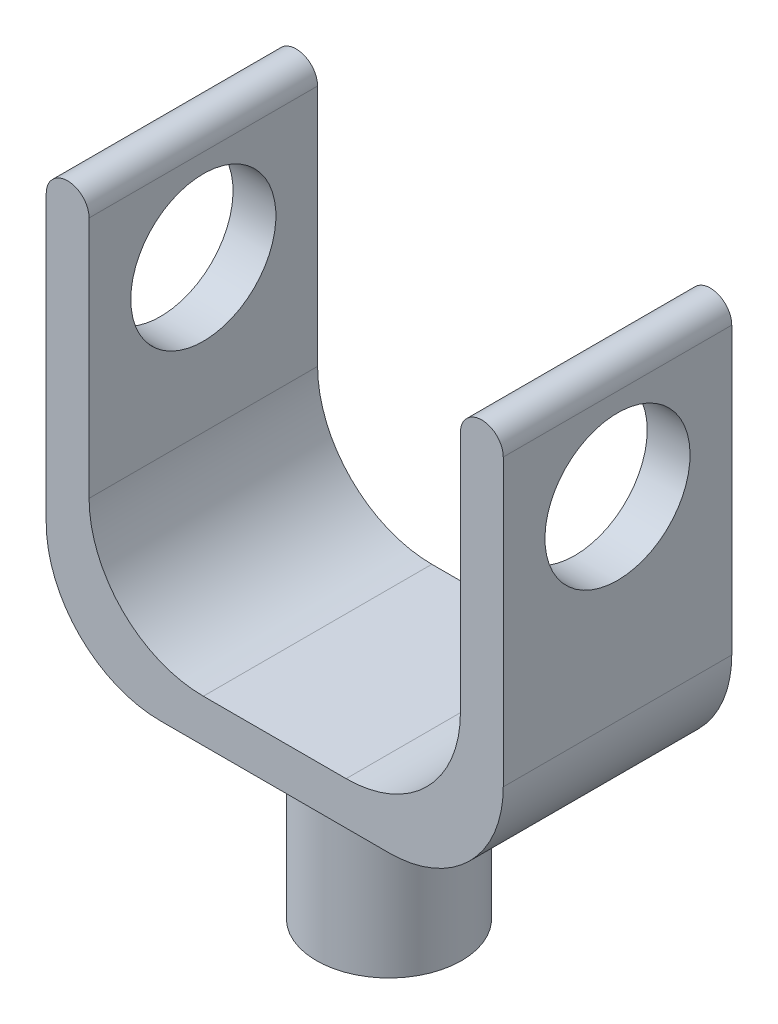
ISO-10303-21;
HEADER;
FILE_DESCRIPTION(('STEP AP214'),'2;1');
FILE_NAME('part.step','',(''),(''),'','','');
FILE_SCHEMA(('AUTOMOTIVE_DESIGN { 1 0 10303 214 1 1 1 1 }'));
ENDSEC;
DATA;
#1=APPLICATION_CONTEXT('core data for automotive mechanical design processes');
#2=APPLICATION_PROTOCOL_DEFINITION('international standard','automotive_design',2000,#1);
#3=PRODUCT_CONTEXT('',#1,'mechanical');
#4=PRODUCT('Part','Part','',(#3));
#5=PRODUCT_RELATED_PRODUCT_CATEGORY('part','',(#4));
#6=PRODUCT_DEFINITION_FORMATION('','',#4);
#7=PRODUCT_DEFINITION_CONTEXT('part definition',#1,'design');
#8=PRODUCT_DEFINITION('design','',#6,#7);
#9=PRODUCT_DEFINITION_SHAPE('','',#8);
#10=(LENGTH_UNIT() NAMED_UNIT(*) SI_UNIT(.MILLI.,.METRE.));
#11=(NAMED_UNIT(*) PLANE_ANGLE_UNIT() SI_UNIT($,.RADIAN.));
#12=(NAMED_UNIT(*) SI_UNIT($,.STERADIAN.) SOLID_ANGLE_UNIT());
#13=UNCERTAINTY_MEASURE_WITH_UNIT(LENGTH_MEASURE(1.E-05),#10,'distance_accuracy_value','');
#14=(GEOMETRIC_REPRESENTATION_CONTEXT(3) GLOBAL_UNCERTAINTY_ASSIGNED_CONTEXT((#13)) GLOBAL_UNIT_ASSIGNED_CONTEXT((#10,
#11,#12)) REPRESENTATION_CONTEXT('',''));
#15=CARTESIAN_POINT('',(0.,0.,0.));
#16=DIRECTION('',(0.,0.,1.));
#17=DIRECTION('',(1.,0.,0.));
#18=AXIS2_PLACEMENT_3D('',#15,#16,#17);
#19=CARTESIAN_POINT('',(-36.25,70.,20.));
#20=DIRECTION('',(0.,0.,-1.));
#21=DIRECTION('',(-1.,0.,0.));
#22=AXIS2_PLACEMENT_3D('',#19,#20,#21);
#23=CYLINDRICAL_SURFACE('',#22,3.75);
#24=CARTESIAN_POINT('',(-36.25,70.,-20.));
#25=DIRECTION('',(0.,0.,1.));
#26=DIRECTION('',(-1.,0.,0.));
#27=AXIS2_PLACEMENT_3D('',#24,#25,#26);
#28=CIRCLE('',#27,3.75);
#29=CARTESIAN_POINT('',(-32.5,70.,-20.));
#30=VERTEX_POINT('',#29);
#31=CARTESIAN_POINT('',(-40.,70.,-20.));
#32=VERTEX_POINT('',#31);
#33=EDGE_CURVE('E147',#30,#32,#28,.T.);
#34=ORIENTED_EDGE('',*,*,#33,.T.);
#35=DIRECTION('',(0.,0.,-1.));
#36=VECTOR('',#35,1.);
#37=CARTESIAN_POINT('',(-40.,70.,20.));
#38=LINE('',#37,#36);
#39=CARTESIAN_POINT('',(-40.,70.,20.));
#40=VERTEX_POINT('',#39);
#41=EDGE_CURVE('E130',#40,#32,#38,.T.);
#42=ORIENTED_EDGE('',*,*,#41,.F.);
#43=CARTESIAN_POINT('',(-36.25,70.,20.));
#44=DIRECTION('',(0.,0.,1.));
#45=DIRECTION('',(-1.,0.,0.));
#46=AXIS2_PLACEMENT_3D('',#43,#44,#45);
#47=CIRCLE('',#46,3.75);
#48=CARTESIAN_POINT('',(-32.5,70.,20.));
#49=VERTEX_POINT('',#48);
#50=EDGE_CURVE('E135',#49,#40,#47,.T.);
#51=ORIENTED_EDGE('',*,*,#50,.F.);
#52=DIRECTION('',(0.,0.,-1.));
#53=VECTOR('',#52,1.);
#54=CARTESIAN_POINT('',(-32.5,70.,20.));
#55=LINE('',#54,#53);
#56=EDGE_CURVE('E220',#49,#30,#55,.T.);
#57=ORIENTED_EDGE('',*,*,#56,.T.);
#58=EDGE_LOOP('',(#34,#42,#51,#57));
#59=FACE_BOUND('',#58,.T.);
#60=ADVANCED_FACE('F36',(#59),#23,.T.);
#61=CARTESIAN_POINT('',(-40.,70.,20.));
#62=DIRECTION('',(1.,0.,0.));
#63=DIRECTION('',(0.,1.,0.));
#64=AXIS2_PLACEMENT_3D('',#61,#62,#63);
#65=PLANE('',#64);
#66=CARTESIAN_POINT('',(-40.,54.,0.));
#67=DIRECTION('',(1.,0.,0.));
#68=DIRECTION('',(0.,1.,0.));
#69=AXIS2_PLACEMENT_3D('',#66,#67,#68);
#70=CIRCLE('',#69,12.7);
#71=CARTESIAN_POINT('',(-40.,66.7,0.));
#72=VERTEX_POINT('',#71);
#73=EDGE_CURVE('E329',#72,#72,#70,.T.);
#74=ORIENTED_EDGE('',*,*,#73,.T.);
#75=EDGE_LOOP('',(#74));
#76=FACE_BOUND('',#75,.T.);
#77=DIRECTION('',(0.,-1.,0.));
#78=VECTOR('',#77,1.);
#79=CARTESIAN_POINT('',(-40.,70.,-20.));
#80=LINE('',#79,#78);
#81=CARTESIAN_POINT('',(-40.,20.,-20.));
#82=VERTEX_POINT('',#81);
#83=EDGE_CURVE('E227',#32,#82,#80,.T.);
#84=ORIENTED_EDGE('',*,*,#83,.T.);
#85=DIRECTION('',(0.,0.,-1.));
#86=VECTOR('',#85,1.);
#87=CARTESIAN_POINT('',(-40.,20.,20.));
#88=LINE('',#87,#86);
#89=CARTESIAN_POINT('',(-40.,20.,20.));
#90=VERTEX_POINT('',#89);
#91=EDGE_CURVE('E52',#82,#90,#88,.F.);
#92=ORIENTED_EDGE('',*,*,#91,.T.);
#93=DIRECTION('',(0.,-1.,0.));
#94=VECTOR('',#93,1.);
#95=CARTESIAN_POINT('',(-40.,70.,20.));
#96=LINE('',#95,#94);
#97=EDGE_CURVE('E126',#40,#90,#96,.T.);
#98=ORIENTED_EDGE('',*,*,#97,.F.);
#99=ORIENTED_EDGE('',*,*,#41,.T.);
#100=EDGE_LOOP('',(#84,#92,#98,#99));
#101=FACE_BOUND('',#100,.T.);
#102=ADVANCED_FACE('F128',(#76,#101),#65,.F.);
#103=CARTESIAN_POINT('',(-40.,0.,20.));
#104=DIRECTION('',(0.,1.,0.));
#105=DIRECTION('',(-1.,0.,0.));
#106=AXIS2_PLACEMENT_3D('',#103,#104,#105);
#107=PLANE('',#106);
#108=CARTESIAN_POINT('',(0.,0.,0.));
#109=DIRECTION('',(0.,-1.,0.));
#110=DIRECTION('',(1.,0.,0.));
#111=AXIS2_PLACEMENT_3D('',#108,#109,#110);
#112=CIRCLE('',#111,12.7);
#113=CARTESIAN_POINT('',(12.7,0.,0.));
#114=VERTEX_POINT('',#113);
#115=EDGE_CURVE('E148',#114,#114,#112,.T.);
#116=ORIENTED_EDGE('',*,*,#115,.F.);
#117=EDGE_LOOP('',(#116));
#118=FACE_BOUND('',#117,.T.);
#119=DIRECTION('',(1.,0.,0.));
#120=VECTOR('',#119,1.);
#121=CARTESIAN_POINT('',(-40.,0.,-20.));
#122=LINE('',#121,#120);
#123=CARTESIAN_POINT('',(-20.,0.,-20.));
#124=VERTEX_POINT('',#123);
#125=CARTESIAN_POINT('',(20.,0.,-20.));
#126=VERTEX_POINT('',#125);
#127=EDGE_CURVE('E230',#124,#126,#122,.T.);
#128=ORIENTED_EDGE('',*,*,#127,.T.);
#129=DIRECTION('',(0.,0.,-1.));
#130=VECTOR('',#129,1.);
#131=CARTESIAN_POINT('',(20.,0.,20.));
#132=LINE('',#131,#130);
#133=CARTESIAN_POINT('',(20.,0.,20.));
#134=VERTEX_POINT('',#133);
#135=EDGE_CURVE('E60',#126,#134,#132,.F.);
#136=ORIENTED_EDGE('',*,*,#135,.T.);
#137=DIRECTION('',(1.,0.,0.));
#138=VECTOR('',#137,1.);
#139=CARTESIAN_POINT('',(-40.,0.,20.));
#140=LINE('',#139,#138);
#141=CARTESIAN_POINT('',(-20.,0.,20.));
#142=VERTEX_POINT('',#141);
#143=EDGE_CURVE('E134',#142,#134,#140,.T.);
#144=ORIENTED_EDGE('',*,*,#143,.F.);
#145=DIRECTION('',(0.,0.,-1.));
#146=VECTOR('',#145,1.);
#147=CARTESIAN_POINT('',(-20.,0.,20.));
#148=LINE('',#147,#146);
#149=EDGE_CURVE('E175',#142,#124,#148,.T.);
#150=ORIENTED_EDGE('',*,*,#149,.T.);
#151=EDGE_LOOP('',(#128,#136,#144,#150));
#152=FACE_BOUND('',#151,.T.);
#153=ADVANCED_FACE('F243',(#118,#152),#107,.F.);
#154=CARTESIAN_POINT('',(40.,0.,20.));
#155=DIRECTION('',(-1.,0.,0.));
#156=DIRECTION('',(0.,0.,1.));
#157=AXIS2_PLACEMENT_3D('',#154,#155,#156);
#158=PLANE('',#157);
#159=CARTESIAN_POINT('',(40.,54.,0.));
#160=DIRECTION('',(-1.,0.,0.));
#161=DIRECTION('',(0.,-1.,0.));
#162=AXIS2_PLACEMENT_3D('',#159,#160,#161);
#163=CIRCLE('',#162,12.7);
#164=CARTESIAN_POINT('',(40.,41.3,0.));
#165=VERTEX_POINT('',#164);
#166=EDGE_CURVE('E337',#165,#165,#163,.T.);
#167=ORIENTED_EDGE('',*,*,#166,.T.);
#168=EDGE_LOOP('',(#167));
#169=FACE_BOUND('',#168,.T.);
#170=DIRECTION('',(0.,1.,0.));
#171=VECTOR('',#170,1.);
#172=CARTESIAN_POINT('',(40.,0.,20.));
#173=LINE('',#172,#171);
#174=CARTESIAN_POINT('',(40.,20.,20.));
#175=VERTEX_POINT('',#174);
#176=CARTESIAN_POINT('',(40.,70.,20.));
#177=VERTEX_POINT('',#176);
#178=EDGE_CURVE('E244',#175,#177,#173,.T.);
#179=ORIENTED_EDGE('',*,*,#178,.F.);
#180=DIRECTION('',(0.,0.,-1.));
#181=VECTOR('',#180,1.);
#182=CARTESIAN_POINT('',(40.,20.,20.));
#183=LINE('',#182,#181);
#184=CARTESIAN_POINT('',(40.,20.,-20.));
#185=VERTEX_POINT('',#184);
#186=EDGE_CURVE('E168',#175,#185,#183,.T.);
#187=ORIENTED_EDGE('',*,*,#186,.T.);
#188=DIRECTION('',(0.,1.,0.));
#189=VECTOR('',#188,1.);
#190=CARTESIAN_POINT('',(40.,0.,-20.));
#191=LINE('',#190,#189);
#192=CARTESIAN_POINT('',(40.,70.,-20.));
#193=VERTEX_POINT('',#192);
#194=EDGE_CURVE('E232',#185,#193,#191,.T.);
#195=ORIENTED_EDGE('',*,*,#194,.T.);
#196=DIRECTION('',(0.,0.,-1.));
#197=VECTOR('',#196,1.);
#198=CARTESIAN_POINT('',(40.,70.,20.));
#199=LINE('',#198,#197);
#200=EDGE_CURVE('E149',#177,#193,#199,.T.);
#201=ORIENTED_EDGE('',*,*,#200,.F.);
#202=EDGE_LOOP('',(#179,#187,#195,#201));
#203=FACE_BOUND('',#202,.T.);
#204=ADVANCED_FACE('F253',(#169,#203),#158,.F.);
#205=CARTESIAN_POINT('',(36.25,70.,20.));
#206=DIRECTION('',(0.,0.,-1.));
#207=DIRECTION('',(-1.,0.,0.));
#208=AXIS2_PLACEMENT_3D('',#205,#206,#207);
#209=CYLINDRICAL_SURFACE('',#208,3.75);
#210=CARTESIAN_POINT('',(36.25,70.,-20.));
#211=DIRECTION('',(0.,0.,1.));
#212=DIRECTION('',(1.,0.,0.));
#213=AXIS2_PLACEMENT_3D('',#210,#211,#212);
#214=CIRCLE('',#213,3.75);
#215=CARTESIAN_POINT('',(32.5,70.,-20.));
#216=VERTEX_POINT('',#215);
#217=EDGE_CURVE('E207',#193,#216,#214,.T.);
#218=ORIENTED_EDGE('',*,*,#217,.T.);
#219=DIRECTION('',(0.,0.,-1.));
#220=VECTOR('',#219,1.);
#221=CARTESIAN_POINT('',(32.5,70.,20.));
#222=LINE('',#221,#220);
#223=CARTESIAN_POINT('',(32.5,70.,20.));
#224=VERTEX_POINT('',#223);
#225=EDGE_CURVE('E155',#224,#216,#222,.T.);
#226=ORIENTED_EDGE('',*,*,#225,.F.);
#227=CARTESIAN_POINT('',(36.25,70.,20.));
#228=DIRECTION('',(0.,0.,1.));
#229=DIRECTION('',(1.,0.,0.));
#230=AXIS2_PLACEMENT_3D('',#227,#228,#229);
#231=CIRCLE('',#230,3.75);
#232=EDGE_CURVE('E222',#177,#224,#231,.T.);
#233=ORIENTED_EDGE('',*,*,#232,.F.);
#234=ORIENTED_EDGE('',*,*,#200,.T.);
#235=EDGE_LOOP('',(#218,#226,#233,#234));
#236=FACE_BOUND('',#235,.T.);
#237=ADVANCED_FACE('F251',(#236),#209,.T.);
#238=CARTESIAN_POINT('',(32.5,7.5,20.));
#239=DIRECTION('',(1.,0.,0.));
#240=DIRECTION('',(0.,0.,-1.));
#241=AXIS2_PLACEMENT_3D('',#238,#239,#240);
#242=PLANE('',#241);
#243=CARTESIAN_POINT('',(32.5,54.,0.));
#244=DIRECTION('',(1.,0.,0.));
#245=DIRECTION('',(0.,0.,-1.));
#246=AXIS2_PLACEMENT_3D('',#243,#244,#245);
#247=CIRCLE('',#246,12.7);
#248=CARTESIAN_POINT('',(32.5,54.,-12.7));
#249=VERTEX_POINT('',#248);
#250=EDGE_CURVE('E330',#249,#249,#247,.T.);
#251=ORIENTED_EDGE('',*,*,#250,.T.);
#252=EDGE_LOOP('',(#251));
#253=FACE_BOUND('',#252,.T.);
#254=DIRECTION('',(0.,-1.,0.));
#255=VECTOR('',#254,1.);
#256=CARTESIAN_POINT('',(32.5,7.5,-20.));
#257=LINE('',#256,#255);
#258=CARTESIAN_POINT('',(32.5,27.5,-20.));
#259=VERTEX_POINT('',#258);
#260=EDGE_CURVE('E195',#216,#259,#257,.T.);
#261=ORIENTED_EDGE('',*,*,#260,.T.);
#262=DIRECTION('',(0.,0.,-1.));
#263=VECTOR('',#262,1.);
#264=CARTESIAN_POINT('',(32.5,27.5,20.));
#265=LINE('',#264,#263);
#266=CARTESIAN_POINT('',(32.5,27.5,20.));
#267=VERTEX_POINT('',#266);
#268=EDGE_CURVE('E166',#259,#267,#265,.F.);
#269=ORIENTED_EDGE('',*,*,#268,.T.);
#270=DIRECTION('',(0.,-1.,0.));
#271=VECTOR('',#270,1.);
#272=CARTESIAN_POINT('',(32.5,7.5,20.));
#273=LINE('',#272,#271);
#274=EDGE_CURVE('E215',#224,#267,#273,.T.);
#275=ORIENTED_EDGE('',*,*,#274,.F.);
#276=ORIENTED_EDGE('',*,*,#225,.T.);
#277=EDGE_LOOP('',(#261,#269,#275,#276));
#278=FACE_BOUND('',#277,.T.);
#279=ADVANCED_FACE('F203',(#253,#278),#242,.F.);
#280=CARTESIAN_POINT('',(-32.5,7.5,20.));
#281=DIRECTION('',(0.,-1.,0.));
#282=DIRECTION('',(0.,0.,-1.));
#283=AXIS2_PLACEMENT_3D('',#280,#281,#282);
#284=PLANE('',#283);
#285=DIRECTION('',(-1.,0.,0.));
#286=VECTOR('',#285,1.);
#287=CARTESIAN_POINT('',(-32.5,7.5,-20.));
#288=LINE('',#287,#286);
#289=CARTESIAN_POINT('',(12.5,7.5,-20.));
#290=VERTEX_POINT('',#289);
#291=CARTESIAN_POINT('',(-12.5,7.5,-20.));
#292=VERTEX_POINT('',#291);
#293=EDGE_CURVE('E197',#290,#292,#288,.T.);
#294=ORIENTED_EDGE('',*,*,#293,.T.);
#295=DIRECTION('',(0.,0.,-1.));
#296=VECTOR('',#295,1.);
#297=CARTESIAN_POINT('',(-12.5,7.5,20.));
#298=LINE('',#297,#296);
#299=CARTESIAN_POINT('',(-12.5,7.5,20.));
#300=VERTEX_POINT('',#299);
#301=EDGE_CURVE('E164',#292,#300,#298,.F.);
#302=ORIENTED_EDGE('',*,*,#301,.T.);
#303=DIRECTION('',(-1.,0.,0.));
#304=VECTOR('',#303,1.);
#305=CARTESIAN_POINT('',(-32.5,7.5,20.));
#306=LINE('',#305,#304);
#307=CARTESIAN_POINT('',(12.5,7.5,20.));
#308=VERTEX_POINT('',#307);
#309=EDGE_CURVE('E213',#308,#300,#306,.T.);
#310=ORIENTED_EDGE('',*,*,#309,.F.);
#311=DIRECTION('',(0.,0.,-1.));
#312=VECTOR('',#311,1.);
#313=CARTESIAN_POINT('',(12.5,7.5,-20.));
#314=LINE('',#313,#312);
#315=EDGE_CURVE('E161',#308,#290,#314,.T.);
#316=ORIENTED_EDGE('',*,*,#315,.T.);
#317=EDGE_LOOP('',(#294,#302,#310,#316));
#318=FACE_BOUND('',#317,.T.);
#319=ADVANCED_FACE('F217',(#318),#284,.F.);
#320=CARTESIAN_POINT('',(-32.5,70.,20.));
#321=DIRECTION('',(-1.,0.,0.));
#322=DIRECTION('',(0.,0.,1.));
#323=AXIS2_PLACEMENT_3D('',#320,#321,#322);
#324=PLANE('',#323);
#325=CARTESIAN_POINT('',(-32.5,54.,0.));
#326=DIRECTION('',(-1.,0.,0.));
#327=DIRECTION('',(0.,0.,1.));
#328=AXIS2_PLACEMENT_3D('',#325,#326,#327);
#329=CIRCLE('',#328,12.7);
#330=CARTESIAN_POINT('',(-32.5,54.,12.7));
#331=VERTEX_POINT('',#330);
#332=EDGE_CURVE('E40',#331,#331,#329,.T.);
#333=ORIENTED_EDGE('',*,*,#332,.T.);
#334=EDGE_LOOP('',(#333));
#335=FACE_BOUND('',#334,.T.);
#336=DIRECTION('',(0.,1.,0.));
#337=VECTOR('',#336,1.);
#338=CARTESIAN_POINT('',(-32.5,70.,20.));
#339=LINE('',#338,#337);
#340=CARTESIAN_POINT('',(-32.5,27.5,20.));
#341=VERTEX_POINT('',#340);
#342=EDGE_CURVE('E140',#341,#49,#339,.T.);
#343=ORIENTED_EDGE('',*,*,#342,.F.);
#344=DIRECTION('',(0.,0.,-1.));
#345=VECTOR('',#344,1.);
#346=CARTESIAN_POINT('',(-32.5,27.5,-20.));
#347=LINE('',#346,#345);
#348=CARTESIAN_POINT('',(-32.5,27.5,-20.));
#349=VERTEX_POINT('',#348);
#350=EDGE_CURVE('E152',#341,#349,#347,.T.);
#351=ORIENTED_EDGE('',*,*,#350,.T.);
#352=DIRECTION('',(0.,1.,0.));
#353=VECTOR('',#352,1.);
#354=CARTESIAN_POINT('',(-32.5,70.,-20.));
#355=LINE('',#354,#353);
#356=EDGE_CURVE('E144',#349,#30,#355,.T.);
#357=ORIENTED_EDGE('',*,*,#356,.T.);
#358=ORIENTED_EDGE('',*,*,#56,.F.);
#359=EDGE_LOOP('',(#343,#351,#357,#358));
#360=FACE_BOUND('',#359,.T.);
#361=ADVANCED_FACE('F284',(#335,#360),#324,.F.);
#362=CARTESIAN_POINT('',(-36.25,70.,20.));
#363=DIRECTION('',(0.,0.,-1.));
#364=DIRECTION('',(-1.,0.,0.));
#365=AXIS2_PLACEMENT_3D('',#362,#363,#364);
#366=PLANE('',#365);
#367=ORIENTED_EDGE('',*,*,#143,.T.);
#368=CARTESIAN_POINT('',(20.,20.,20.));
#369=DIRECTION('',(0.,0.,-1.));
#370=DIRECTION('',(-1.,0.,0.));
#371=AXIS2_PLACEMENT_3D('',#368,#369,#370);
#372=CIRCLE('',#371,20.);
#373=EDGE_CURVE('E181',#134,#175,#372,.F.);
#374=ORIENTED_EDGE('',*,*,#373,.T.);
#375=ORIENTED_EDGE('',*,*,#178,.T.);
#376=ORIENTED_EDGE('',*,*,#232,.T.);
#377=ORIENTED_EDGE('',*,*,#274,.T.);
#378=CARTESIAN_POINT('',(12.5,27.5,20.));
#379=DIRECTION('',(0.,0.,-1.));
#380=DIRECTION('',(-1.,0.,0.));
#381=AXIS2_PLACEMENT_3D('',#378,#379,#380);
#382=CIRCLE('',#381,20.);
#383=EDGE_CURVE('E11',#267,#308,#382,.T.);
#384=ORIENTED_EDGE('',*,*,#383,.T.);
#385=ORIENTED_EDGE('',*,*,#309,.T.);
#386=CARTESIAN_POINT('',(-12.5,27.5,20.));
#387=DIRECTION('',(0.,0.,-1.));
#388=DIRECTION('',(-1.,0.,0.));
#389=AXIS2_PLACEMENT_3D('',#386,#387,#388);
#390=CIRCLE('',#389,20.);
#391=EDGE_CURVE('E186',#300,#341,#390,.T.);
#392=ORIENTED_EDGE('',*,*,#391,.T.);
#393=ORIENTED_EDGE('',*,*,#342,.T.);
#394=ORIENTED_EDGE('',*,*,#50,.T.);
#395=ORIENTED_EDGE('',*,*,#97,.T.);
#396=CARTESIAN_POINT('',(-20.,20.,20.));
#397=DIRECTION('',(0.,0.,-1.));
#398=DIRECTION('',(-1.,0.,0.));
#399=AXIS2_PLACEMENT_3D('',#396,#397,#398);
#400=CIRCLE('',#399,20.);
#401=EDGE_CURVE('E179',#90,#142,#400,.F.);
#402=ORIENTED_EDGE('',*,*,#401,.T.);
#403=EDGE_LOOP('',(#367,#374,#375,#376,#377,#384,#385,#392,#393,#394,#395,#402));
#404=FACE_BOUND('',#403,.T.);
#405=ADVANCED_FACE('F138',(#404),#366,.F.);
#406=CARTESIAN_POINT('',(-36.25,70.,-20.));
#407=DIRECTION('',(0.,0.,-1.));
#408=DIRECTION('',(-1.,0.,0.));
#409=AXIS2_PLACEMENT_3D('',#406,#407,#408);
#410=PLANE('',#409);
#411=ORIENTED_EDGE('',*,*,#194,.F.);
#412=CARTESIAN_POINT('',(20.,20.,-20.));
#413=DIRECTION('',(0.,0.,-1.));
#414=DIRECTION('',(-1.,0.,0.));
#415=AXIS2_PLACEMENT_3D('',#412,#413,#414);
#416=CIRCLE('',#415,20.);
#417=EDGE_CURVE('E173',#185,#126,#416,.T.);
#418=ORIENTED_EDGE('',*,*,#417,.T.);
#419=ORIENTED_EDGE('',*,*,#127,.F.);
#420=CARTESIAN_POINT('',(-20.,20.,-20.));
#421=DIRECTION('',(0.,0.,-1.));
#422=DIRECTION('',(-1.,0.,0.));
#423=AXIS2_PLACEMENT_3D('',#420,#421,#422);
#424=CIRCLE('',#423,20.);
#425=EDGE_CURVE('E171',#124,#82,#424,.T.);
#426=ORIENTED_EDGE('',*,*,#425,.T.);
#427=ORIENTED_EDGE('',*,*,#83,.F.);
#428=ORIENTED_EDGE('',*,*,#33,.F.);
#429=ORIENTED_EDGE('',*,*,#356,.F.);
#430=CARTESIAN_POINT('',(-12.5,27.5,-20.));
#431=DIRECTION('',(0.,0.,-1.));
#432=DIRECTION('',(-1.,0.,0.));
#433=AXIS2_PLACEMENT_3D('',#430,#431,#432);
#434=CIRCLE('',#433,20.);
#435=EDGE_CURVE('E184',#349,#292,#434,.F.);
#436=ORIENTED_EDGE('',*,*,#435,.T.);
#437=ORIENTED_EDGE('',*,*,#293,.F.);
#438=CARTESIAN_POINT('',(12.5,27.5,-20.));
#439=DIRECTION('',(0.,0.,-1.));
#440=DIRECTION('',(-1.,0.,0.));
#441=AXIS2_PLACEMENT_3D('',#438,#439,#440);
#442=CIRCLE('',#441,20.);
#443=EDGE_CURVE('E45',#290,#259,#442,.F.);
#444=ORIENTED_EDGE('',*,*,#443,.T.);
#445=ORIENTED_EDGE('',*,*,#260,.F.);
#446=ORIENTED_EDGE('',*,*,#217,.F.);
#447=EDGE_LOOP('',(#411,#418,#419,#426,#427,#428,#429,#436,#437,#444,#445,#446));
#448=FACE_BOUND('',#447,.T.);
#449=ADVANCED_FACE('F193',(#448),#410,.T.);
#450=CARTESIAN_POINT('',(0.,-30.,0.));
#451=DIRECTION('',(0.,1.,0.));
#452=DIRECTION('',(-1.,0.,0.));
#453=AXIS2_PLACEMENT_3D('',#450,#451,#452);
#454=CYLINDRICAL_SURFACE('',#453,12.7);
#455=CARTESIAN_POINT('',(0.,-30.,0.));
#456=DIRECTION('',(0.,-1.,0.));
#457=DIRECTION('',(1.,0.,0.));
#458=AXIS2_PLACEMENT_3D('',#455,#456,#457);
#459=CIRCLE('',#458,12.7);
#460=CARTESIAN_POINT('',(12.7,-30.,0.));
#461=VERTEX_POINT('',#460);
#462=EDGE_CURVE('E228',#461,#461,#459,.T.);
#463=ORIENTED_EDGE('',*,*,#462,.F.);
#464=EDGE_LOOP('',(#463));
#465=FACE_BOUND('',#464,.T.);
#466=ORIENTED_EDGE('',*,*,#115,.T.);
#467=EDGE_LOOP('',(#466));
#468=FACE_BOUND('',#467,.T.);
#469=ADVANCED_FACE('F280',(#465,#468),#454,.T.);
#470=CARTESIAN_POINT('',(0.,-30.,0.));
#471=DIRECTION('',(0.,-1.,0.));
#472=DIRECTION('',(1.,0.,0.));
#473=AXIS2_PLACEMENT_3D('',#470,#471,#472);
#474=PLANE('',#473);
#475=ORIENTED_EDGE('',*,*,#462,.T.);
#476=EDGE_LOOP('',(#475));
#477=FACE_BOUND('',#476,.T.);
#478=ADVANCED_FACE('F275',(#477),#474,.T.);
#479=CARTESIAN_POINT('',(-12.5,27.5,20.));
#480=DIRECTION('',(0.,0.,1.));
#481=DIRECTION('',(1.,0.,0.));
#482=AXIS2_PLACEMENT_3D('',#479,#480,#481);
#483=CYLINDRICAL_SURFACE('',#482,20.);
#484=ORIENTED_EDGE('',*,*,#391,.F.);
#485=ORIENTED_EDGE('',*,*,#301,.F.);
#486=ORIENTED_EDGE('',*,*,#435,.F.);
#487=ORIENTED_EDGE('',*,*,#350,.F.);
#488=EDGE_LOOP('',(#484,#485,#486,#487));
#489=FACE_BOUND('',#488,.T.);
#490=ADVANCED_FACE('F263',(#489),#483,.F.);
#491=CARTESIAN_POINT('',(12.5,27.5,20.));
#492=DIRECTION('',(0.,0.,1.));
#493=DIRECTION('',(1.,0.,0.));
#494=AXIS2_PLACEMENT_3D('',#491,#492,#493);
#495=CYLINDRICAL_SURFACE('',#494,20.);
#496=ORIENTED_EDGE('',*,*,#383,.F.);
#497=ORIENTED_EDGE('',*,*,#268,.F.);
#498=ORIENTED_EDGE('',*,*,#443,.F.);
#499=ORIENTED_EDGE('',*,*,#315,.F.);
#500=EDGE_LOOP('',(#496,#497,#498,#499));
#501=FACE_BOUND('',#500,.T.);
#502=ADVANCED_FACE('F210',(#501),#495,.F.);
#503=CARTESIAN_POINT('',(20.,20.,20.));
#504=DIRECTION('',(0.,0.,-1.));
#505=DIRECTION('',(-1.,0.,0.));
#506=AXIS2_PLACEMENT_3D('',#503,#504,#505);
#507=CYLINDRICAL_SURFACE('',#506,20.);
#508=ORIENTED_EDGE('',*,*,#373,.F.);
#509=ORIENTED_EDGE('',*,*,#135,.F.);
#510=ORIENTED_EDGE('',*,*,#417,.F.);
#511=ORIENTED_EDGE('',*,*,#186,.F.);
#512=EDGE_LOOP('',(#508,#509,#510,#511));
#513=FACE_BOUND('',#512,.T.);
#514=ADVANCED_FACE('F256',(#513),#507,.T.);
#515=CARTESIAN_POINT('',(-20.,20.,20.));
#516=DIRECTION('',(0.,0.,-1.));
#517=DIRECTION('',(-1.,0.,0.));
#518=AXIS2_PLACEMENT_3D('',#515,#516,#517);
#519=CYLINDRICAL_SURFACE('',#518,20.);
#520=ORIENTED_EDGE('',*,*,#401,.F.);
#521=ORIENTED_EDGE('',*,*,#91,.F.);
#522=ORIENTED_EDGE('',*,*,#425,.F.);
#523=ORIENTED_EDGE('',*,*,#149,.F.);
#524=EDGE_LOOP('',(#520,#521,#522,#523));
#525=FACE_BOUND('',#524,.T.);
#526=ADVANCED_FACE('F38',(#525),#519,.T.);
#527=CARTESIAN_POINT('',(40.,54.,0.));
#528=DIRECTION('',(-1.,0.,0.));
#529=DIRECTION('',(0.,-1.,0.));
#530=AXIS2_PLACEMENT_3D('',#527,#528,#529);
#531=CYLINDRICAL_SURFACE('',#530,12.7);
#532=ORIENTED_EDGE('',*,*,#332,.F.);
#533=EDGE_LOOP('',(#532));
#534=FACE_BOUND('',#533,.T.);
#535=ORIENTED_EDGE('',*,*,#73,.F.);
#536=EDGE_LOOP('',(#535));
#537=FACE_BOUND('',#536,.T.);
#538=ADVANCED_FACE('F262',(#534,#537),#531,.F.);
#539=ORIENTED_EDGE('',*,*,#166,.F.);
#540=EDGE_LOOP('',(#539));
#541=FACE_BOUND('',#540,.T.);
#542=ORIENTED_EDGE('',*,*,#250,.F.);
#543=EDGE_LOOP('',(#542));
#544=FACE_BOUND('',#543,.T.);
#545=ADVANCED_FACE('F319',(#541,#544),#531,.F.);
#546=CLOSED_SHELL('',(#60,#102,#153,#204,#237,#279,#319,#361,#405,#449,#469,#478,#490,#502,#514,
#526,#538,#545));
#547=MANIFOLD_SOLID_BREP('B2',#546);
#548=ADVANCED_BREP_SHAPE_REPRESENTATION('',(#18,#547),#14);
#549=SHAPE_DEFINITION_REPRESENTATION(#9,#548);
ENDSEC;
END-ISO-10303-21;
